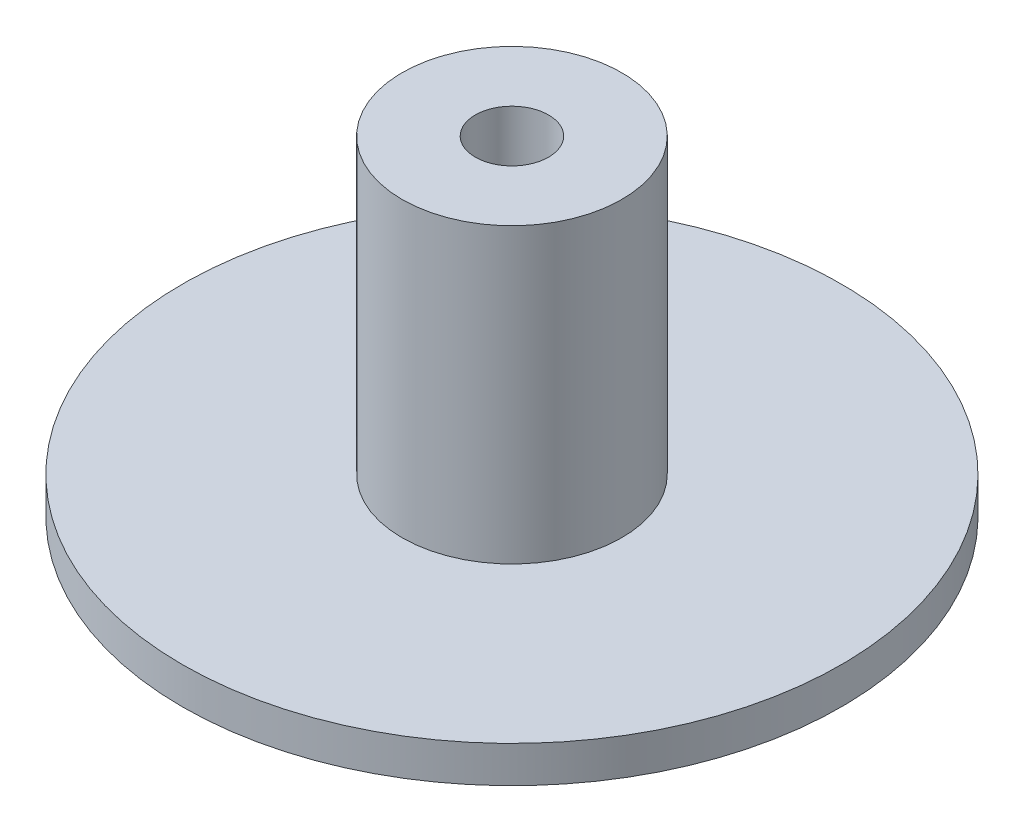
ISO-10303-21;
HEADER;
FILE_DESCRIPTION(('STEP AP214'),'2;1');
FILE_NAME('part.step','',(''),(''),'','','');
FILE_SCHEMA(('AUTOMOTIVE_DESIGN { 1 0 10303 214 1 1 1 1 }'));
ENDSEC;
DATA;
#1=APPLICATION_CONTEXT('core data for automotive mechanical design processes');
#2=APPLICATION_PROTOCOL_DEFINITION('international standard','automotive_design',2000,#1);
#3=PRODUCT_CONTEXT('',#1,'mechanical');
#4=PRODUCT('Part','Part','',(#3));
#5=PRODUCT_RELATED_PRODUCT_CATEGORY('part','',(#4));
#6=PRODUCT_DEFINITION_FORMATION('','',#4);
#7=PRODUCT_DEFINITION_CONTEXT('part definition',#1,'design');
#8=PRODUCT_DEFINITION('design','',#6,#7);
#9=PRODUCT_DEFINITION_SHAPE('','',#8);
#10=(LENGTH_UNIT() NAMED_UNIT(*) SI_UNIT(.MILLI.,.METRE.));
#11=(NAMED_UNIT(*) PLANE_ANGLE_UNIT() SI_UNIT($,.RADIAN.));
#12=(NAMED_UNIT(*) SI_UNIT($,.STERADIAN.) SOLID_ANGLE_UNIT());
#13=UNCERTAINTY_MEASURE_WITH_UNIT(LENGTH_MEASURE(1.E-05),#10,'distance_accuracy_value','');
#14=(GEOMETRIC_REPRESENTATION_CONTEXT(3) GLOBAL_UNCERTAINTY_ASSIGNED_CONTEXT((#13)) GLOBAL_UNIT_ASSIGNED_CONTEXT((#10,
#11,#12)) REPRESENTATION_CONTEXT('',''));
#15=CARTESIAN_POINT('',(0.,0.,0.));
#16=DIRECTION('',(0.,0.,1.));
#17=DIRECTION('',(1.,0.,0.));
#18=AXIS2_PLACEMENT_3D('',#15,#16,#17);
#19=CARTESIAN_POINT('',(0.,0.,0.));
#20=DIRECTION('',(0.,-1.,0.));
#21=DIRECTION('',(0.,0.,-1.));
#22=AXIS2_PLACEMENT_3D('',#19,#20,#21);
#23=PLANE('',#22);
#24=CARTESIAN_POINT('',(0.,0.,0.));
#25=DIRECTION('',(0.,1.,0.));
#26=DIRECTION('',(0.,0.,1.));
#27=AXIS2_PLACEMENT_3D('',#24,#25,#26);
#28=CIRCLE('',#27,19.05);
#29=CARTESIAN_POINT('',(0.,0.,19.05));
#30=VERTEX_POINT('',#29);
#31=EDGE_CURVE('E10',#30,#30,#28,.T.);
#32=ORIENTED_EDGE('',*,*,#31,.F.);
#33=EDGE_LOOP('',(#32));
#34=FACE_BOUND('',#33,.T.);
#35=CARTESIAN_POINT('',(0.,0.,0.));
#36=DIRECTION('',(0.,1.,0.));
#37=DIRECTION('',(0.,0.,1.));
#38=AXIS2_PLACEMENT_3D('',#35,#36,#37);
#39=CIRCLE('',#38,57.15);
#40=CARTESIAN_POINT('',(0.,0.,57.15));
#41=VERTEX_POINT('',#40);
#42=EDGE_CURVE('E40',#41,#41,#39,.T.);
#43=ORIENTED_EDGE('',*,*,#42,.T.);
#44=EDGE_LOOP('',(#43));
#45=FACE_BOUND('',#44,.T.);
#46=ADVANCED_FACE('F37',(#34,#45),#23,.F.);
#47=CARTESIAN_POINT('',(0.,0.,0.));
#48=DIRECTION('',(0.,1.,0.));
#49=DIRECTION('',(0.,0.,1.));
#50=AXIS2_PLACEMENT_3D('',#47,#48,#49);
#51=CYLINDRICAL_SURFACE('',#50,57.15);
#52=ORIENTED_EDGE('',*,*,#42,.F.);
#53=EDGE_LOOP('',(#52));
#54=FACE_BOUND('',#53,.T.);
#55=CARTESIAN_POINT('',(0.,-6.35,0.));
#56=DIRECTION('',(0.,1.,0.));
#57=DIRECTION('',(0.,0.,1.));
#58=AXIS2_PLACEMENT_3D('',#55,#56,#57);
#59=CIRCLE('',#58,57.15);
#60=CARTESIAN_POINT('',(0.,-6.35,57.15));
#61=VERTEX_POINT('',#60);
#62=EDGE_CURVE('E50',#61,#61,#59,.T.);
#63=ORIENTED_EDGE('',*,*,#62,.T.);
#64=EDGE_LOOP('',(#63));
#65=FACE_BOUND('',#64,.T.);
#66=ADVANCED_FACE('F89',(#54,#65),#51,.T.);
#67=CARTESIAN_POINT('',(57.15,-6.35,0.));
#68=DIRECTION('',(0.,1.,0.));
#69=DIRECTION('',(0.,0.,1.));
#70=AXIS2_PLACEMENT_3D('',#67,#68,#69);
#71=PLANE('',#70);
#72=CARTESIAN_POINT('',(0.,-6.35,0.));
#73=DIRECTION('',(0.,1.,0.));
#74=DIRECTION('',(0.,0.,1.));
#75=AXIS2_PLACEMENT_3D('',#72,#73,#74);
#76=CIRCLE('',#75,6.35);
#77=CARTESIAN_POINT('',(0.,-6.35,6.35));
#78=VERTEX_POINT('',#77);
#79=EDGE_CURVE('E60',#78,#78,#76,.T.);
#80=ORIENTED_EDGE('',*,*,#79,.T.);
#81=EDGE_LOOP('',(#80));
#82=FACE_BOUND('',#81,.T.);
#83=ORIENTED_EDGE('',*,*,#62,.F.);
#84=EDGE_LOOP('',(#83));
#85=FACE_BOUND('',#84,.T.);
#86=ADVANCED_FACE('F85',(#82,#85),#71,.F.);
#87=CARTESIAN_POINT('',(0.,50.8,0.));
#88=DIRECTION('',(0.,-1.,0.));
#89=DIRECTION('',(0.,0.,-1.));
#90=AXIS2_PLACEMENT_3D('',#87,#88,#89);
#91=CYLINDRICAL_SURFACE('',#90,19.05);
#92=CARTESIAN_POINT('',(0.,50.8,0.));
#93=DIRECTION('',(0.,1.,0.));
#94=DIRECTION('',(0.,0.,1.));
#95=AXIS2_PLACEMENT_3D('',#92,#93,#94);
#96=CIRCLE('',#95,19.05);
#97=CARTESIAN_POINT('',(0.,50.8,19.05));
#98=VERTEX_POINT('',#97);
#99=EDGE_CURVE('E52',#98,#98,#96,.T.);
#100=ORIENTED_EDGE('',*,*,#99,.F.);
#101=EDGE_LOOP('',(#100));
#102=FACE_BOUND('',#101,.T.);
#103=ORIENTED_EDGE('',*,*,#31,.T.);
#104=EDGE_LOOP('',(#103));
#105=FACE_BOUND('',#104,.T.);
#106=ADVANCED_FACE('F78',(#102,#105),#91,.T.);
#107=CARTESIAN_POINT('',(0.,50.8,0.));
#108=DIRECTION('',(0.,1.,0.));
#109=DIRECTION('',(0.,0.,1.));
#110=AXIS2_PLACEMENT_3D('',#107,#108,#109);
#111=PLANE('',#110);
#112=CARTESIAN_POINT('',(0.,50.8,0.));
#113=DIRECTION('',(0.,1.,0.));
#114=DIRECTION('',(0.,0.,1.));
#115=AXIS2_PLACEMENT_3D('',#112,#113,#114);
#116=CIRCLE('',#115,6.35);
#117=CARTESIAN_POINT('',(0.,50.8,6.35));
#118=VERTEX_POINT('',#117);
#119=EDGE_CURVE('E65',#118,#118,#116,.T.);
#120=ORIENTED_EDGE('',*,*,#119,.F.);
#121=EDGE_LOOP('',(#120));
#122=FACE_BOUND('',#121,.T.);
#123=ORIENTED_EDGE('',*,*,#99,.T.);
#124=EDGE_LOOP('',(#123));
#125=FACE_BOUND('',#124,.T.);
#126=ADVANCED_FACE('F76',(#122,#125),#111,.T.);
#127=CARTESIAN_POINT('',(0.,-30.226,0.));
#128=DIRECTION('',(0.,1.,0.));
#129=DIRECTION('',(0.,0.,1.));
#130=AXIS2_PLACEMENT_3D('',#127,#128,#129);
#131=CYLINDRICAL_SURFACE('',#130,6.35);
#132=ORIENTED_EDGE('',*,*,#119,.T.);
#133=EDGE_LOOP('',(#132));
#134=FACE_BOUND('',#133,.T.);
#135=ORIENTED_EDGE('',*,*,#79,.F.);
#136=EDGE_LOOP('',(#135));
#137=FACE_BOUND('',#136,.T.);
#138=ADVANCED_FACE('F73',(#134,#137),#131,.F.);
#139=CLOSED_SHELL('',(#46,#66,#86,#106,#126,#138));
#140=MANIFOLD_SOLID_BREP('B2',#139);
#141=ADVANCED_BREP_SHAPE_REPRESENTATION('',(#18,#140),#14);
#142=SHAPE_DEFINITION_REPRESENTATION(#9,#141);
ENDSEC;
END-ISO-10303-21;
